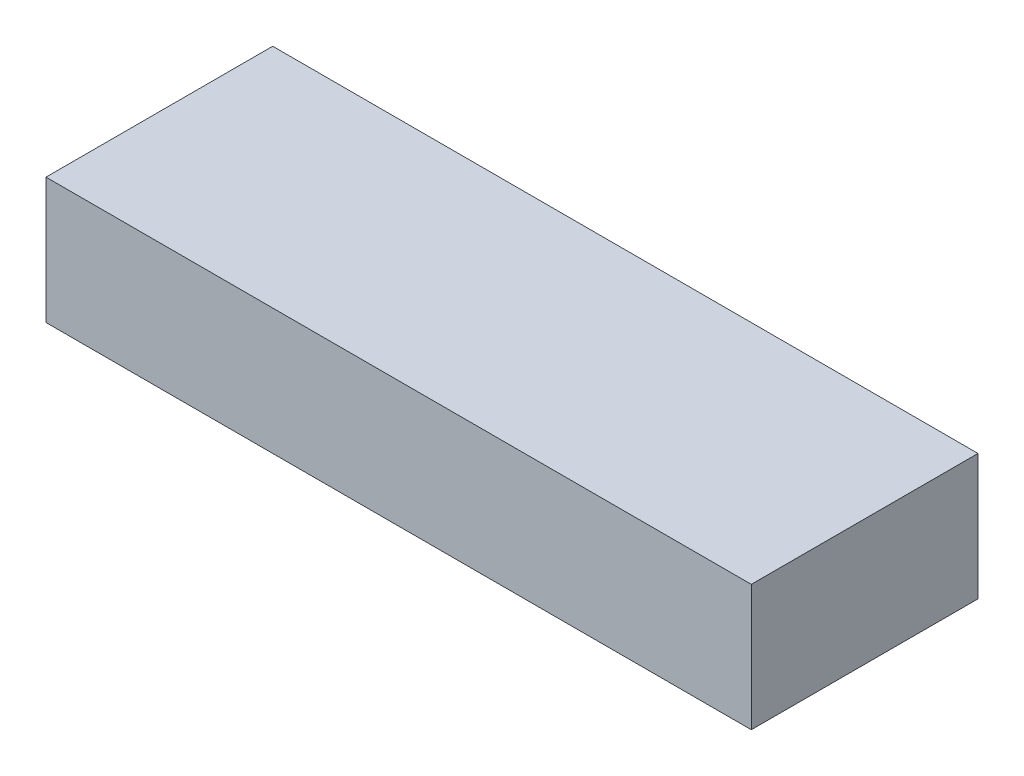
ISO-10303-21;
HEADER;
FILE_DESCRIPTION(('STEP AP214'),'2;1');
FILE_NAME('part.step','',(''),(''),'','','');
FILE_SCHEMA(('AUTOMOTIVE_DESIGN { 1 0 10303 214 1 1 1 1 }'));
ENDSEC;
DATA;
#1=APPLICATION_CONTEXT('core data for automotive mechanical design processes');
#2=APPLICATION_PROTOCOL_DEFINITION('international standard','automotive_design',2000,#1);
#3=PRODUCT_CONTEXT('',#1,'mechanical');
#4=PRODUCT('Part','Part','',(#3));
#5=PRODUCT_RELATED_PRODUCT_CATEGORY('part','',(#4));
#6=PRODUCT_DEFINITION_FORMATION('','',#4);
#7=PRODUCT_DEFINITION_CONTEXT('part definition',#1,'design');
#8=PRODUCT_DEFINITION('design','',#6,#7);
#9=PRODUCT_DEFINITION_SHAPE('','',#8);
#10=(LENGTH_UNIT() NAMED_UNIT(*) SI_UNIT(.MILLI.,.METRE.));
#11=(NAMED_UNIT(*) PLANE_ANGLE_UNIT() SI_UNIT($,.RADIAN.));
#12=(NAMED_UNIT(*) SI_UNIT($,.STERADIAN.) SOLID_ANGLE_UNIT());
#13=UNCERTAINTY_MEASURE_WITH_UNIT(LENGTH_MEASURE(1.E-05),#10,'distance_accuracy_value','');
#14=(GEOMETRIC_REPRESENTATION_CONTEXT(3) GLOBAL_UNCERTAINTY_ASSIGNED_CONTEXT((#13)) GLOBAL_UNIT_ASSIGNED_CONTEXT((#10,
#11,#12)) REPRESENTATION_CONTEXT('',''));
#15=CARTESIAN_POINT('',(0.,0.,0.));
#16=DIRECTION('',(0.,0.,1.));
#17=DIRECTION('',(1.,0.,0.));
#18=AXIS2_PLACEMENT_3D('',#15,#16,#17);
#19=CARTESIAN_POINT('',(-70.,25.,22.5));
#20=DIRECTION('',(1.,0.,0.));
#21=DIRECTION('',(0.,0.,-1.));
#22=AXIS2_PLACEMENT_3D('',#19,#20,#21);
#23=PLANE('',#22);
#24=DIRECTION('',(0.,0.,1.));
#25=VECTOR('',#24,1.);
#26=CARTESIAN_POINT('',(-70.,0.,22.5));
#27=LINE('',#26,#25);
#28=CARTESIAN_POINT('',(-70.,0.,-22.5));
#29=VERTEX_POINT('',#28);
#30=CARTESIAN_POINT('',(-70.,0.,22.5));
#31=VERTEX_POINT('',#30);
#32=EDGE_CURVE('E95',#29,#31,#27,.T.);
#33=ORIENTED_EDGE('',*,*,#32,.T.);
#34=DIRECTION('',(0.,-1.,0.));
#35=VECTOR('',#34,1.);
#36=CARTESIAN_POINT('',(-70.,25.,22.5));
#37=LINE('',#36,#35);
#38=CARTESIAN_POINT('',(-70.,25.,22.5));
#39=VERTEX_POINT('',#38);
#40=EDGE_CURVE('E11',#39,#31,#37,.T.);
#41=ORIENTED_EDGE('',*,*,#40,.F.);
#42=DIRECTION('',(0.,0.,1.));
#43=VECTOR('',#42,1.);
#44=CARTESIAN_POINT('',(-70.,25.,22.5));
#45=LINE('',#44,#43);
#46=CARTESIAN_POINT('',(-70.,25.,-22.5));
#47=VERTEX_POINT('',#46);
#48=EDGE_CURVE('E83',#47,#39,#45,.T.);
#49=ORIENTED_EDGE('',*,*,#48,.F.);
#50=DIRECTION('',(0.,-1.,0.));
#51=VECTOR('',#50,1.);
#52=CARTESIAN_POINT('',(-70.,25.,-22.5));
#53=LINE('',#52,#51);
#54=EDGE_CURVE('E91',#47,#29,#53,.T.);
#55=ORIENTED_EDGE('',*,*,#54,.T.);
#56=EDGE_LOOP('',(#33,#41,#49,#55));
#57=FACE_BOUND('',#56,.T.);
#58=ADVANCED_FACE('F32',(#57),#23,.F.);
#59=CARTESIAN_POINT('',(70.,25.,22.5));
#60=DIRECTION('',(0.,0.,-1.));
#61=DIRECTION('',(-1.,0.,0.));
#62=AXIS2_PLACEMENT_3D('',#59,#60,#61);
#63=PLANE('',#62);
#64=DIRECTION('',(1.,0.,0.));
#65=VECTOR('',#64,1.);
#66=CARTESIAN_POINT('',(70.,0.,22.5));
#67=LINE('',#66,#65);
#68=CARTESIAN_POINT('',(70.,0.,22.5));
#69=VERTEX_POINT('',#68);
#70=EDGE_CURVE('E87',#31,#69,#67,.T.);
#71=ORIENTED_EDGE('',*,*,#70,.T.);
#72=DIRECTION('',(0.,-1.,0.));
#73=VECTOR('',#72,1.);
#74=CARTESIAN_POINT('',(70.,25.,22.5));
#75=LINE('',#74,#73);
#76=CARTESIAN_POINT('',(70.,25.,22.5));
#77=VERTEX_POINT('',#76);
#78=EDGE_CURVE('E40',#77,#69,#75,.T.);
#79=ORIENTED_EDGE('',*,*,#78,.F.);
#80=DIRECTION('',(1.,0.,0.));
#81=VECTOR('',#80,1.);
#82=CARTESIAN_POINT('',(70.,25.,22.5));
#83=LINE('',#82,#81);
#84=EDGE_CURVE('E78',#39,#77,#83,.T.);
#85=ORIENTED_EDGE('',*,*,#84,.F.);
#86=ORIENTED_EDGE('',*,*,#40,.T.);
#87=EDGE_LOOP('',(#71,#79,#85,#86));
#88=FACE_BOUND('',#87,.T.);
#89=ADVANCED_FACE('F86',(#88),#63,.F.);
#90=CARTESIAN_POINT('',(70.,25.,22.5));
#91=DIRECTION('',(-1.,0.,0.));
#92=DIRECTION('',(0.,0.,1.));
#93=AXIS2_PLACEMENT_3D('',#90,#91,#92);
#94=PLANE('',#93);
#95=DIRECTION('',(0.,0.,-1.));
#96=VECTOR('',#95,1.);
#97=CARTESIAN_POINT('',(70.,0.,22.5));
#98=LINE('',#97,#96);
#99=CARTESIAN_POINT('',(70.,0.,-22.5));
#100=VERTEX_POINT('',#99);
#101=EDGE_CURVE('E65',#69,#100,#98,.T.);
#102=ORIENTED_EDGE('',*,*,#101,.T.);
#103=DIRECTION('',(0.,-1.,0.));
#104=VECTOR('',#103,1.);
#105=CARTESIAN_POINT('',(70.,25.,-22.5));
#106=LINE('',#105,#104);
#107=CARTESIAN_POINT('',(70.,25.,-22.5));
#108=VERTEX_POINT('',#107);
#109=EDGE_CURVE('E88',#108,#100,#106,.T.);
#110=ORIENTED_EDGE('',*,*,#109,.F.);
#111=DIRECTION('',(0.,0.,-1.));
#112=VECTOR('',#111,1.);
#113=CARTESIAN_POINT('',(70.,25.,22.5));
#114=LINE('',#113,#112);
#115=EDGE_CURVE('E81',#77,#108,#114,.T.);
#116=ORIENTED_EDGE('',*,*,#115,.F.);
#117=ORIENTED_EDGE('',*,*,#78,.T.);
#118=EDGE_LOOP('',(#102,#110,#116,#117));
#119=FACE_BOUND('',#118,.T.);
#120=ADVANCED_FACE('F89',(#119),#94,.F.);
#121=CARTESIAN_POINT('',(70.,25.,-22.5));
#122=DIRECTION('',(0.,0.,1.));
#123=DIRECTION('',(1.,0.,0.));
#124=AXIS2_PLACEMENT_3D('',#121,#122,#123);
#125=PLANE('',#124);
#126=DIRECTION('',(-1.,0.,0.));
#127=VECTOR('',#126,1.);
#128=CARTESIAN_POINT('',(70.,0.,-22.5));
#129=LINE('',#128,#127);
#130=EDGE_CURVE('E71',#100,#29,#129,.T.);
#131=ORIENTED_EDGE('',*,*,#130,.T.);
#132=ORIENTED_EDGE('',*,*,#54,.F.);
#133=DIRECTION('',(-1.,0.,0.));
#134=VECTOR('',#133,1.);
#135=CARTESIAN_POINT('',(70.,25.,-22.5));
#136=LINE('',#135,#134);
#137=EDGE_CURVE('E48',#108,#47,#136,.T.);
#138=ORIENTED_EDGE('',*,*,#137,.F.);
#139=ORIENTED_EDGE('',*,*,#109,.T.);
#140=EDGE_LOOP('',(#131,#132,#138,#139));
#141=FACE_BOUND('',#140,.T.);
#142=ADVANCED_FACE('F102',(#141),#125,.F.);
#143=CARTESIAN_POINT('',(0.,25.,0.));
#144=DIRECTION('',(0.,1.,0.));
#145=DIRECTION('',(0.,0.,1.));
#146=AXIS2_PLACEMENT_3D('',#143,#144,#145);
#147=PLANE('',#146);
#148=ORIENTED_EDGE('',*,*,#48,.T.);
#149=ORIENTED_EDGE('',*,*,#84,.T.);
#150=ORIENTED_EDGE('',*,*,#115,.T.);
#151=ORIENTED_EDGE('',*,*,#137,.T.);
#152=EDGE_LOOP('',(#148,#149,#150,#151));
#153=FACE_BOUND('',#152,.T.);
#154=ADVANCED_FACE('F79',(#153),#147,.T.);
#155=CARTESIAN_POINT('',(0.,0.,0.));
#156=DIRECTION('',(0.,1.,0.));
#157=DIRECTION('',(0.,0.,1.));
#158=AXIS2_PLACEMENT_3D('',#155,#156,#157);
#159=PLANE('',#158);
#160=ORIENTED_EDGE('',*,*,#32,.F.);
#161=ORIENTED_EDGE('',*,*,#130,.F.);
#162=ORIENTED_EDGE('',*,*,#101,.F.);
#163=ORIENTED_EDGE('',*,*,#70,.F.);
#164=EDGE_LOOP('',(#160,#161,#162,#163));
#165=FACE_BOUND('',#164,.T.);
#166=ADVANCED_FACE('F105',(#165),#159,.F.);
#167=CLOSED_SHELL('',(#58,#89,#120,#142,#154,#166));
#168=MANIFOLD_SOLID_BREP('B2',#167);
#169=ADVANCED_BREP_SHAPE_REPRESENTATION('',(#18,#168),#14);
#170=SHAPE_DEFINITION_REPRESENTATION(#9,#169);
ENDSEC;
END-ISO-10303-21;
